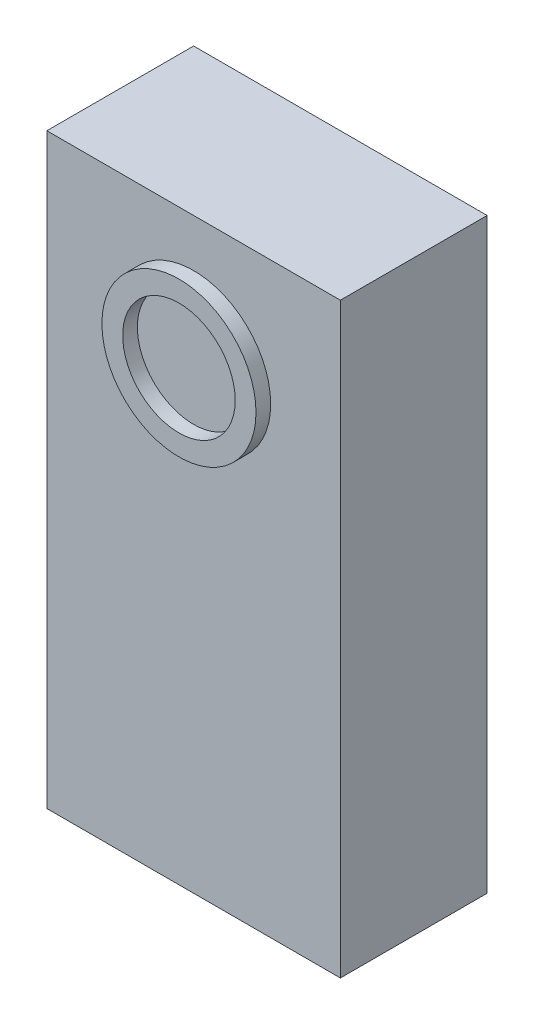
ISO-10303-21;
HEADER;
FILE_DESCRIPTION(('STEP AP214'),'2;1');
FILE_NAME('part.step','',(''),(''),'','','');
FILE_SCHEMA(('AUTOMOTIVE_DESIGN { 1 0 10303 214 1 1 1 1 }'));
ENDSEC;
DATA;
#1=APPLICATION_CONTEXT('core data for automotive mechanical design processes');
#2=APPLICATION_PROTOCOL_DEFINITION('international standard','automotive_design',2000,#1);
#3=PRODUCT_CONTEXT('',#1,'mechanical');
#4=PRODUCT('Part','Part','',(#3));
#5=PRODUCT_RELATED_PRODUCT_CATEGORY('part','',(#4));
#6=PRODUCT_DEFINITION_FORMATION('','',#4);
#7=PRODUCT_DEFINITION_CONTEXT('part definition',#1,'design');
#8=PRODUCT_DEFINITION('design','',#6,#7);
#9=PRODUCT_DEFINITION_SHAPE('','',#8);
#10=(LENGTH_UNIT() NAMED_UNIT(*) SI_UNIT(.MILLI.,.METRE.));
#11=(NAMED_UNIT(*) PLANE_ANGLE_UNIT() SI_UNIT($,.RADIAN.));
#12=(NAMED_UNIT(*) SI_UNIT($,.STERADIAN.) SOLID_ANGLE_UNIT());
#13=UNCERTAINTY_MEASURE_WITH_UNIT(LENGTH_MEASURE(1.E-05),#10,'distance_accuracy_value','');
#14=(GEOMETRIC_REPRESENTATION_CONTEXT(3) GLOBAL_UNCERTAINTY_ASSIGNED_CONTEXT((#13)) GLOBAL_UNIT_ASSIGNED_CONTEXT((#10,
#11,#12)) REPRESENTATION_CONTEXT('',''));
#15=CARTESIAN_POINT('',(0.,0.,0.));
#16=DIRECTION('',(0.,0.,1.));
#17=DIRECTION('',(1.,0.,0.));
#18=AXIS2_PLACEMENT_3D('',#15,#16,#17);
#19=CARTESIAN_POINT('',(1.,1.99999999999999,1.));
#20=DIRECTION('',(-1.,0.,0.));
#21=DIRECTION('',(0.,-1.,0.));
#22=AXIS2_PLACEMENT_3D('',#19,#20,#21);
#23=PLANE('',#22);
#24=DIRECTION('',(0.,1.,0.));
#25=VECTOR('',#24,1.);
#26=CARTESIAN_POINT('',(1.,1.99999999999999,0.));
#27=LINE('',#26,#25);
#28=CARTESIAN_POINT('',(1.,-2.00000000000001,0.));
#29=VERTEX_POINT('',#28);
#30=CARTESIAN_POINT('',(1.,1.99999999999999,0.));
#31=VERTEX_POINT('',#30);
#32=EDGE_CURVE('E113',#29,#31,#27,.T.);
#33=ORIENTED_EDGE('',*,*,#32,.T.);
#34=DIRECTION('',(0.,0.,-1.));
#35=VECTOR('',#34,1.);
#36=CARTESIAN_POINT('',(1.,1.99999999999999,1.));
#37=LINE('',#36,#35);
#38=CARTESIAN_POINT('',(1.,1.99999999999999,1.));
#39=VERTEX_POINT('',#38);
#40=EDGE_CURVE('E55',#39,#31,#37,.T.);
#41=ORIENTED_EDGE('',*,*,#40,.F.);
#42=DIRECTION('',(0.,1.,0.));
#43=VECTOR('',#42,1.);
#44=CARTESIAN_POINT('',(1.,1.99999999999999,1.));
#45=LINE('',#44,#43);
#46=CARTESIAN_POINT('',(1.,-2.00000000000001,1.));
#47=VERTEX_POINT('',#46);
#48=EDGE_CURVE('E99',#47,#39,#45,.T.);
#49=ORIENTED_EDGE('',*,*,#48,.F.);
#50=DIRECTION('',(0.,0.,-1.));
#51=VECTOR('',#50,1.);
#52=CARTESIAN_POINT('',(1.,-2.00000000000001,1.));
#53=LINE('',#52,#51);
#54=EDGE_CURVE('E109',#47,#29,#53,.T.);
#55=ORIENTED_EDGE('',*,*,#54,.T.);
#56=EDGE_LOOP('',(#33,#41,#49,#55));
#57=FACE_BOUND('',#56,.T.);
#58=ADVANCED_FACE('F47',(#57),#23,.F.);
#59=CARTESIAN_POINT('',(-0.999999999999999,1.99999999999999,1.));
#60=DIRECTION('',(0.,-1.,0.));
#61=DIRECTION('',(0.,0.,-1.));
#62=AXIS2_PLACEMENT_3D('',#59,#60,#61);
#63=PLANE('',#62);
#64=DIRECTION('',(-1.,0.,0.));
#65=VECTOR('',#64,1.);
#66=CARTESIAN_POINT('',(-0.999999999999999,1.99999999999999,0.));
#67=LINE('',#66,#65);
#68=CARTESIAN_POINT('',(-0.999999999999999,1.99999999999999,0.));
#69=VERTEX_POINT('',#68);
#70=EDGE_CURVE('E104',#31,#69,#67,.T.);
#71=ORIENTED_EDGE('',*,*,#70,.T.);
#72=DIRECTION('',(0.,0.,-1.));
#73=VECTOR('',#72,1.);
#74=CARTESIAN_POINT('',(-0.999999999999999,1.99999999999999,1.));
#75=LINE('',#74,#73);
#76=CARTESIAN_POINT('',(-0.999999999999999,1.99999999999999,1.));
#77=VERTEX_POINT('',#76);
#78=EDGE_CURVE('E102',#77,#69,#75,.T.);
#79=ORIENTED_EDGE('',*,*,#78,.F.);
#80=DIRECTION('',(-1.,0.,0.));
#81=VECTOR('',#80,1.);
#82=CARTESIAN_POINT('',(-0.999999999999999,1.99999999999999,1.));
#83=LINE('',#82,#81);
#84=EDGE_CURVE('E94',#39,#77,#83,.T.);
#85=ORIENTED_EDGE('',*,*,#84,.F.);
#86=ORIENTED_EDGE('',*,*,#40,.T.);
#87=EDGE_LOOP('',(#71,#79,#85,#86));
#88=FACE_BOUND('',#87,.T.);
#89=ADVANCED_FACE('F103',(#88),#63,.F.);
#90=CARTESIAN_POINT('',(-0.999999999999999,1.99999999999999,1.));
#91=DIRECTION('',(1.,0.,0.));
#92=DIRECTION('',(0.,1.,0.));
#93=AXIS2_PLACEMENT_3D('',#90,#91,#92);
#94=PLANE('',#93);
#95=DIRECTION('',(0.,-1.,0.));
#96=VECTOR('',#95,1.);
#97=CARTESIAN_POINT('',(-0.999999999999999,1.99999999999999,0.));
#98=LINE('',#97,#96);
#99=CARTESIAN_POINT('',(-0.999999999999999,-2.00000000000001,0.));
#100=VERTEX_POINT('',#99);
#101=EDGE_CURVE('E80',#69,#100,#98,.T.);
#102=ORIENTED_EDGE('',*,*,#101,.T.);
#103=DIRECTION('',(0.,0.,-1.));
#104=VECTOR('',#103,1.);
#105=CARTESIAN_POINT('',(-0.999999999999999,-2.00000000000001,1.));
#106=LINE('',#105,#104);
#107=CARTESIAN_POINT('',(-0.999999999999999,-2.00000000000001,1.));
#108=VERTEX_POINT('',#107);
#109=EDGE_CURVE('E105',#108,#100,#106,.T.);
#110=ORIENTED_EDGE('',*,*,#109,.F.);
#111=DIRECTION('',(0.,-1.,0.));
#112=VECTOR('',#111,1.);
#113=CARTESIAN_POINT('',(-0.999999999999999,1.99999999999999,1.));
#114=LINE('',#113,#112);
#115=EDGE_CURVE('E97',#77,#108,#114,.T.);
#116=ORIENTED_EDGE('',*,*,#115,.F.);
#117=ORIENTED_EDGE('',*,*,#78,.T.);
#118=EDGE_LOOP('',(#102,#110,#116,#117));
#119=FACE_BOUND('',#118,.T.);
#120=ADVANCED_FACE('F107',(#119),#94,.F.);
#121=CARTESIAN_POINT('',(-0.999999999999999,-2.00000000000001,1.));
#122=DIRECTION('',(0.,1.,0.));
#123=DIRECTION('',(0.,0.,1.));
#124=AXIS2_PLACEMENT_3D('',#121,#122,#123);
#125=PLANE('',#124);
#126=DIRECTION('',(1.,0.,0.));
#127=VECTOR('',#126,1.);
#128=CARTESIAN_POINT('',(-0.999999999999999,-2.00000000000001,0.));
#129=LINE('',#128,#127);
#130=EDGE_CURVE('E86',#100,#29,#129,.T.);
#131=ORIENTED_EDGE('',*,*,#130,.T.);
#132=ORIENTED_EDGE('',*,*,#54,.F.);
#133=DIRECTION('',(1.,0.,0.));
#134=VECTOR('',#133,1.);
#135=CARTESIAN_POINT('',(-0.999999999999999,-2.00000000000001,1.));
#136=LINE('',#135,#134);
#137=EDGE_CURVE('E63',#108,#47,#136,.T.);
#138=ORIENTED_EDGE('',*,*,#137,.F.);
#139=ORIENTED_EDGE('',*,*,#109,.T.);
#140=EDGE_LOOP('',(#131,#132,#138,#139));
#141=FACE_BOUND('',#140,.T.);
#142=ADVANCED_FACE('F136',(#141),#125,.F.);
#143=CARTESIAN_POINT('',(0.,0.,1.));
#144=DIRECTION('',(0.,0.,1.));
#145=DIRECTION('',(1.,0.,0.));
#146=AXIS2_PLACEMENT_3D('',#143,#144,#145);
#147=PLANE('',#146);
#148=CARTESIAN_POINT('',(0.,1.15,1.));
#149=DIRECTION('',(0.,0.,1.));
#150=DIRECTION('',(1.,0.,0.));
#151=AXIS2_PLACEMENT_3D('',#148,#149,#150);
#152=CIRCLE('',#151,0.525);
#153=CARTESIAN_POINT('',(0.525,1.15,1.));
#154=VERTEX_POINT('',#153);
#155=EDGE_CURVE('E220',#154,#154,#152,.T.);
#156=ORIENTED_EDGE('',*,*,#155,.F.);
#157=EDGE_LOOP('',(#156));
#158=FACE_BOUND('',#157,.T.);
#159=ORIENTED_EDGE('',*,*,#48,.T.);
#160=ORIENTED_EDGE('',*,*,#84,.T.);
#161=ORIENTED_EDGE('',*,*,#115,.T.);
#162=ORIENTED_EDGE('',*,*,#137,.T.);
#163=EDGE_LOOP('',(#159,#160,#161,#162));
#164=FACE_BOUND('',#163,.T.);
#165=ADVANCED_FACE('F95',(#158,#164),#147,.T.);
#166=CARTESIAN_POINT('',(0.,0.,0.));
#167=DIRECTION('',(0.,0.,1.));
#168=DIRECTION('',(1.,0.,0.));
#169=AXIS2_PLACEMENT_3D('',#166,#167,#168);
#170=PLANE('',#169);
#171=ORIENTED_EDGE('',*,*,#32,.F.);
#172=ORIENTED_EDGE('',*,*,#130,.F.);
#173=ORIENTED_EDGE('',*,*,#101,.F.);
#174=ORIENTED_EDGE('',*,*,#70,.F.);
#175=EDGE_LOOP('',(#171,#172,#173,#174));
#176=FACE_BOUND('',#175,.T.);
#177=ADVANCED_FACE('F124',(#176),#170,.F.);
#178=CARTESIAN_POINT('',(0.,1.15,1.1));
#179=DIRECTION('',(0.,0.,1.));
#180=DIRECTION('',(1.,0.,0.));
#181=AXIS2_PLACEMENT_3D('',#178,#179,#180);
#182=PLANE('',#181);
#183=CARTESIAN_POINT('',(0.,1.15,1.1));
#184=DIRECTION('',(0.,0.,1.));
#185=DIRECTION('',(1.,0.,0.));
#186=AXIS2_PLACEMENT_3D('',#183,#184,#185);
#187=CIRCLE('',#186,0.525);
#188=CARTESIAN_POINT('',(0.525,1.15,1.1));
#189=VERTEX_POINT('',#188);
#190=EDGE_CURVE('E116',#189,#189,#187,.T.);
#191=ORIENTED_EDGE('',*,*,#190,.T.);
#192=EDGE_LOOP('',(#191));
#193=FACE_BOUND('',#192,.T.);
#194=CARTESIAN_POINT('',(0.,1.15,1.1));
#195=DIRECTION('',(0.,0.,1.));
#196=DIRECTION('',(1.,0.,0.));
#197=AXIS2_PLACEMENT_3D('',#194,#195,#196);
#198=CIRCLE('',#197,0.383355986834194);
#199=CARTESIAN_POINT('',(0.383355986834194,1.15,1.1));
#200=VERTEX_POINT('',#199);
#201=EDGE_CURVE('E217',#200,#200,#198,.T.);
#202=ORIENTED_EDGE('',*,*,#201,.F.);
#203=EDGE_LOOP('',(#202));
#204=FACE_BOUND('',#203,.T.);
#205=ADVANCED_FACE('F126',(#193,#204),#182,.T.);
#206=CARTESIAN_POINT('',(0.,1.15,1.1));
#207=DIRECTION('',(0.,0.,-1.));
#208=DIRECTION('',(-1.,0.,0.));
#209=AXIS2_PLACEMENT_3D('',#206,#207,#208);
#210=CYLINDRICAL_SURFACE('',#209,0.525);
#211=ORIENTED_EDGE('',*,*,#190,.F.);
#212=EDGE_LOOP('',(#211));
#213=FACE_BOUND('',#212,.T.);
#214=ORIENTED_EDGE('',*,*,#155,.T.);
#215=EDGE_LOOP('',(#214));
#216=FACE_BOUND('',#215,.T.);
#217=ADVANCED_FACE('F133',(#213,#216),#210,.T.);
#218=CARTESIAN_POINT('',(0.,1.15,1.1));
#219=DIRECTION('',(0.,0.,-1.));
#220=DIRECTION('',(-1.,0.,0.));
#221=AXIS2_PLACEMENT_3D('',#218,#219,#220);
#222=CYLINDRICAL_SURFACE('',#221,0.383355986834194);
#223=ORIENTED_EDGE('',*,*,#201,.T.);
#224=EDGE_LOOP('',(#223));
#225=FACE_BOUND('',#224,.T.);
#226=CARTESIAN_POINT('',(0.,1.15,1.));
#227=DIRECTION('',(0.,0.,1.));
#228=DIRECTION('',(1.,0.,0.));
#229=AXIS2_PLACEMENT_3D('',#226,#227,#228);
#230=CIRCLE('',#229,0.383355986834194);
#231=CARTESIAN_POINT('',(0.383355986834194,1.15,1.));
#232=VERTEX_POINT('',#231);
#233=EDGE_CURVE('E11',#232,#232,#230,.F.);
#234=ORIENTED_EDGE('',*,*,#233,.T.);
#235=EDGE_LOOP('',(#234));
#236=FACE_BOUND('',#235,.T.);
#237=ADVANCED_FACE('F184',(#225,#236),#222,.F.);
#238=ORIENTED_EDGE('',*,*,#233,.F.);
#239=EDGE_LOOP('',(#238));
#240=FACE_BOUND('',#239,.T.);
#241=ADVANCED_FACE('F139',(#240),#147,.T.);
#242=CLOSED_SHELL('',(#58,#89,#120,#142,#165,#177,#205,#217,#237,#241));
#243=MANIFOLD_SOLID_BREP('B2',#242);
#244=ADVANCED_BREP_SHAPE_REPRESENTATION('',(#18,#243),#14);
#245=SHAPE_DEFINITION_REPRESENTATION(#9,#244);
ENDSEC;
END-ISO-10303-21;
